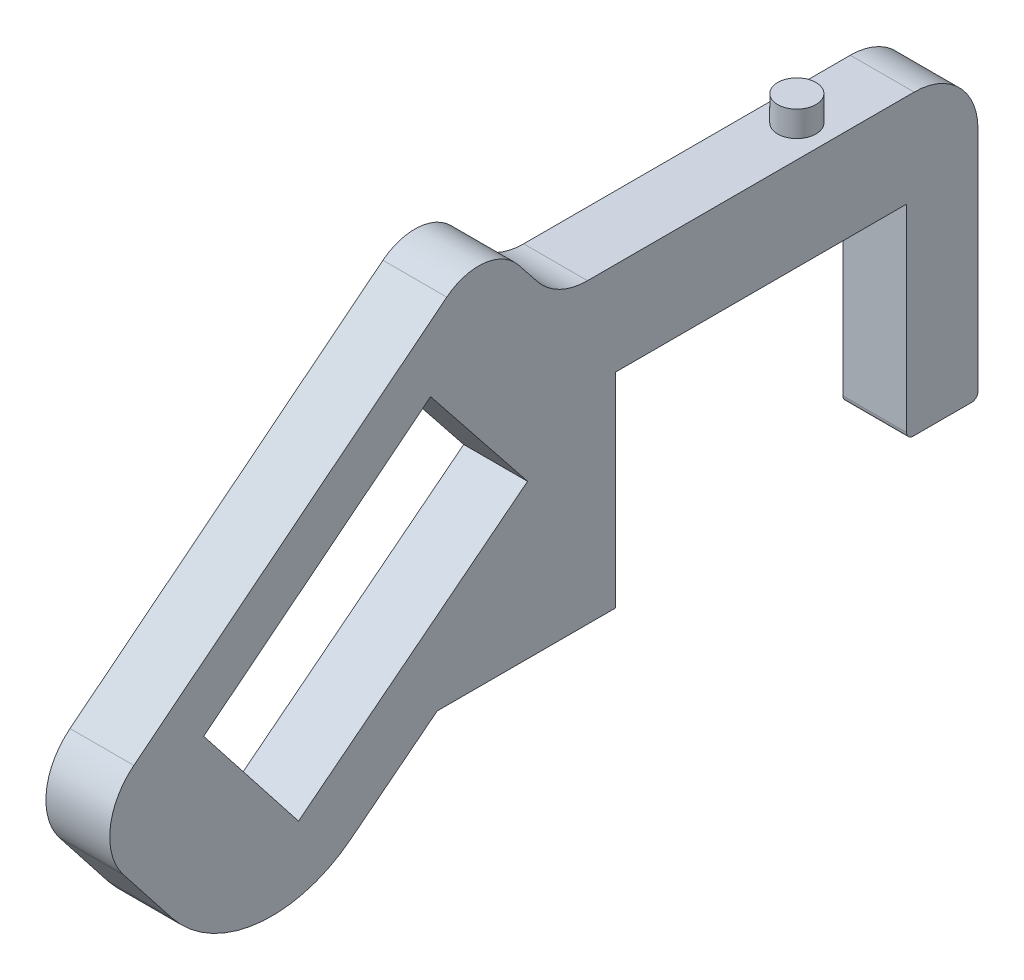
ISO-10303-21;
HEADER;
FILE_DESCRIPTION(('STEP AP214'),'2;1');
FILE_NAME('part.step','',(''),(''),'','','');
FILE_SCHEMA(('AUTOMOTIVE_DESIGN { 1 0 10303 214 1 1 1 1 }'));
ENDSEC;
DATA;
#1=APPLICATION_CONTEXT('core data for automotive mechanical design processes');
#2=APPLICATION_PROTOCOL_DEFINITION('international standard','automotive_design',2000,#1);
#3=PRODUCT_CONTEXT('',#1,'mechanical');
#4=PRODUCT('Part','Part','',(#3));
#5=PRODUCT_RELATED_PRODUCT_CATEGORY('part','',(#4));
#6=PRODUCT_DEFINITION_FORMATION('','',#4);
#7=PRODUCT_DEFINITION_CONTEXT('part definition',#1,'design');
#8=PRODUCT_DEFINITION('design','',#6,#7);
#9=PRODUCT_DEFINITION_SHAPE('','',#8);
#10=(LENGTH_UNIT() NAMED_UNIT(*) SI_UNIT(.MILLI.,.METRE.));
#11=(NAMED_UNIT(*) PLANE_ANGLE_UNIT() SI_UNIT($,.RADIAN.));
#12=(NAMED_UNIT(*) SI_UNIT($,.STERADIAN.) SOLID_ANGLE_UNIT());
#13=UNCERTAINTY_MEASURE_WITH_UNIT(LENGTH_MEASURE(1.E-05),#10,'distance_accuracy_value','');
#14=(GEOMETRIC_REPRESENTATION_CONTEXT(3) GLOBAL_UNCERTAINTY_ASSIGNED_CONTEXT((#13)) GLOBAL_UNIT_ASSIGNED_CONTEXT((#10,
#11,#12)) REPRESENTATION_CONTEXT('',''));
#15=CARTESIAN_POINT('',(0.,0.,0.));
#16=DIRECTION('',(0.,0.,1.));
#17=DIRECTION('',(1.,0.,0.));
#18=AXIS2_PLACEMENT_3D('',#15,#16,#17);
#19=CARTESIAN_POINT('',(5.,15.3,-11.9858517092675));
#20=DIRECTION('',(0.,-1.,0.));
#21=DIRECTION('',(0.,0.,-1.));
#22=AXIS2_PLACEMENT_3D('',#19,#20,#21);
#23=PLANE('',#22);
#24=DIRECTION('',(0.,0.,1.));
#25=VECTOR('',#24,1.);
#26=CARTESIAN_POINT('',(0.,15.3,-11.9858517092675));
#27=LINE('',#26,#25);
#28=CARTESIAN_POINT('',(0.,15.3,-11.9858517092675));
#29=VERTEX_POINT('',#28);
#30=CARTESIAN_POINT('',(0.,15.3,13.5965839190351));
#31=VERTEX_POINT('',#30);
#32=EDGE_CURVE('E274',#29,#31,#27,.T.);
#33=ORIENTED_EDGE('',*,*,#32,.T.);
#34=DIRECTION('',(-1.,0.,0.));
#35=VECTOR('',#34,1.);
#36=CARTESIAN_POINT('',(5.,15.3,13.5965839190351));
#37=LINE('',#36,#35);
#38=CARTESIAN_POINT('',(5.,15.3,13.5965839190351));
#39=VERTEX_POINT('',#38);
#40=EDGE_CURVE('E319',#39,#31,#37,.T.);
#41=ORIENTED_EDGE('',*,*,#40,.F.);
#42=DIRECTION('',(0.,0.,1.));
#43=VECTOR('',#42,1.);
#44=CARTESIAN_POINT('',(5.,15.3,-11.9858517092675));
#45=LINE('',#44,#43);
#46=CARTESIAN_POINT('',(5.,15.3,-11.9858517092675));
#47=VERTEX_POINT('',#46);
#48=EDGE_CURVE('E237',#47,#39,#45,.T.);
#49=ORIENTED_EDGE('',*,*,#48,.F.);
#50=DIRECTION('',(-1.,0.,0.));
#51=VECTOR('',#50,1.);
#52=CARTESIAN_POINT('',(5.,15.3,-11.9858517092675));
#53=LINE('',#52,#51);
#54=EDGE_CURVE('E322',#47,#29,#53,.T.);
#55=ORIENTED_EDGE('',*,*,#54,.T.);
#56=EDGE_LOOP('',(#33,#41,#49,#55));
#57=FACE_BOUND('',#56,.T.);
#58=CARTESIAN_POINT('',(2.5,15.3,-5.29585170926751));
#59=DIRECTION('',(0.,-1.,0.));
#60=DIRECTION('',(0.,0.,-1.));
#61=AXIS2_PLACEMENT_3D('',#58,#59,#60);
#62=CIRCLE('',#61,1.5);
#63=CARTESIAN_POINT('',(2.5,15.3,-6.79585170926751));
#64=VERTEX_POINT('',#63);
#65=EDGE_CURVE('E11',#64,#64,#62,.F.);
#66=ORIENTED_EDGE('',*,*,#65,.F.);
#67=EDGE_LOOP('',(#66));
#68=FACE_BOUND('',#67,.T.);
#69=ADVANCED_FACE('F31',(#57,#68),#23,.F.);
#70=CARTESIAN_POINT('',(5.,-5.43975606599762,38.3096722610078));
#71=DIRECTION('',(-1.,0.,0.));
#72=DIRECTION('',(0.,0.,1.));
#73=AXIS2_PLACEMENT_3D('',#70,#71,#72);
#74=PLANE('',#73);
#75=DIRECTION('',(0.,1.,0.));
#76=VECTOR('',#75,1.);
#77=CARTESIAN_POINT('',(5.,8.,11.4));
#78=LINE('',#77,#76);
#79=CARTESIAN_POINT('',(5.,-8.,11.4));
#80=VERTEX_POINT('',#79);
#81=CARTESIAN_POINT('',(5.,8.,11.4));
#82=VERTEX_POINT('',#81);
#83=EDGE_CURVE('E219',#80,#82,#78,.T.);
#84=ORIENTED_EDGE('',*,*,#83,.T.);
#85=DIRECTION('',(0.,0.,-1.));
#86=VECTOR('',#85,1.);
#87=CARTESIAN_POINT('',(5.,8.,11.4));
#88=LINE('',#87,#86);
#89=CARTESIAN_POINT('',(5.,8.,-11.4));
#90=VERTEX_POINT('',#89);
#91=EDGE_CURVE('E222',#82,#90,#88,.T.);
#92=ORIENTED_EDGE('',*,*,#91,.T.);
#93=DIRECTION('',(0.,-1.,0.));
#94=VECTOR('',#93,1.);
#95=CARTESIAN_POINT('',(5.,8.,-11.4));
#96=LINE('',#95,#94);
#97=CARTESIAN_POINT('',(5.,-7.5,-11.4));
#98=VERTEX_POINT('',#97);
#99=EDGE_CURVE('E225',#90,#98,#96,.T.);
#100=ORIENTED_EDGE('',*,*,#99,.T.);
#101=CARTESIAN_POINT('',(5.,-7.5,-11.9));
#102=DIRECTION('',(1.,0.,0.));
#103=DIRECTION('',(0.,0.,1.));
#104=AXIS2_PLACEMENT_3D('',#101,#102,#103);
#105=CIRCLE('',#104,0.500000000000001);
#106=CARTESIAN_POINT('',(5.,-8.,-11.9));
#107=VERTEX_POINT('',#106);
#108=EDGE_CURVE('E227',#98,#107,#105,.T.);
#109=ORIENTED_EDGE('',*,*,#108,.T.);
#110=DIRECTION('',(0.,0.,-1.));
#111=VECTOR('',#110,1.);
#112=CARTESIAN_POINT('',(5.,-8.,-11.9));
#113=LINE('',#112,#111);
#114=CARTESIAN_POINT('',(5.,-8.,-16.4858517092675));
#115=VERTEX_POINT('',#114);
#116=EDGE_CURVE('E229',#107,#115,#113,.T.);
#117=ORIENTED_EDGE('',*,*,#116,.T.);
#118=CARTESIAN_POINT('',(5.,-7.5,-16.4858517092675));
#119=DIRECTION('',(1.,0.,0.));
#120=DIRECTION('',(0.,0.,-1.));
#121=AXIS2_PLACEMENT_3D('',#118,#119,#120);
#122=CIRCLE('',#121,0.5);
#123=CARTESIAN_POINT('',(5.,-7.5,-16.9858517092675));
#124=VERTEX_POINT('',#123);
#125=EDGE_CURVE('E231',#115,#124,#122,.T.);
#126=ORIENTED_EDGE('',*,*,#125,.T.);
#127=DIRECTION('',(0.,1.,0.));
#128=VECTOR('',#127,1.);
#129=CARTESIAN_POINT('',(5.,-7.5,-16.9858517092675));
#130=LINE('',#129,#128);
#131=CARTESIAN_POINT('',(5.,10.3,-16.9858517092675));
#132=VERTEX_POINT('',#131);
#133=EDGE_CURVE('E233',#124,#132,#130,.T.);
#134=ORIENTED_EDGE('',*,*,#133,.T.);
#135=CARTESIAN_POINT('',(5.,10.3,-11.9858517092675));
#136=DIRECTION('',(1.,0.,0.));
#137=DIRECTION('',(0.,0.,-1.));
#138=AXIS2_PLACEMENT_3D('',#135,#136,#137);
#139=CIRCLE('',#138,5.);
#140=EDGE_CURVE('E235',#132,#47,#139,.T.);
#141=ORIENTED_EDGE('',*,*,#140,.T.);
#142=ORIENTED_EDGE('',*,*,#48,.T.);
#143=CARTESIAN_POINT('',(5.,20.3,13.5965839190351));
#144=DIRECTION('',(-1.,0.,0.));
#145=DIRECTION('',(0.,0.,-1.));
#146=AXIS2_PLACEMENT_3D('',#143,#144,#145);
#147=CIRCLE('',#146,5.00000000000001);
#148=CARTESIAN_POINT('',(5.,17.186353684396,17.5087708549222));
#149=VERTEX_POINT('',#148);
#150=EDGE_CURVE('E239',#39,#149,#147,.T.);
#151=ORIENTED_EDGE('',*,*,#150,.T.);
#152=DIRECTION('',(0.,0.782437387177425,0.622729263120792));
#153=VECTOR('',#152,1.);
#154=CARTESIAN_POINT('',(5.,19.0558817681678,18.9966980233703));
#155=LINE('',#154,#153);
#156=CARTESIAN_POINT('',(5.,19.0558817681678,18.9966980233703));
#157=VERTEX_POINT('',#156);
#158=EDGE_CURVE('E241',#149,#157,#155,.T.);
#159=ORIENTED_EDGE('',*,*,#158,.T.);
#160=CARTESIAN_POINT('',(5.,16.5649647156846,22.12644757208));
#161=DIRECTION('',(1.,0.,0.));
#162=DIRECTION('',(0.,0.,1.));
#163=AXIS2_PLACEMENT_3D('',#160,#161,#162);
#164=CIRCLE('',#163,4.);
#165=CARTESIAN_POINT('',(5.,19.6947142643943,24.6173646245632));
#166=VERTEX_POINT('',#165);
#167=EDGE_CURVE('E243',#157,#166,#164,.T.);
#168=ORIENTED_EDGE('',*,*,#167,.T.);
#169=DIRECTION('',(0.,-0.622729263120793,0.782437387177424));
#170=VECTOR('',#169,1.);
#171=CARTESIAN_POINT('',(5.,19.6947142643943,24.6173646245632));
#172=LINE('',#171,#170);
#173=CARTESIAN_POINT('',(5.,0.189057119503341,49.1255358563794));
#174=VERTEX_POINT('',#173);
#175=EDGE_CURVE('E245',#166,#174,#172,.T.);
#176=ORIENTED_EDGE('',*,*,#175,.T.);
#177=CARTESIAN_POINT('',(5.,-3.7231298163838,46.0118895407754));
#178=DIRECTION('',(1.,0.,0.));
#179=DIRECTION('',(0.,0.,1.));
#180=AXIS2_PLACEMENT_3D('',#177,#178,#179);
#181=CIRCLE('',#180,5.);
#182=CARTESIAN_POINT('',(5.,-6.80954956947025,49.9455917546902));
#183=VERTEX_POINT('',#182);
#184=EDGE_CURVE('E247',#174,#183,#181,.T.);
#185=ORIENTED_EDGE('',*,*,#184,.T.);
#186=DIRECTION('',(0.,-0.786740442782954,-0.617283950617284));
#187=VECTOR('',#186,1.);
#188=CARTESIAN_POINT('',(5.,-6.80954956947025,49.9455917546902));
#189=LINE('',#188,#187);
#190=CARTESIAN_POINT('',(5.,-11.6125955721704,46.1770766888373));
#191=VERTEX_POINT('',#190);
#192=EDGE_CURVE('E249',#183,#191,#189,.T.);
#193=ORIENTED_EDGE('',*,*,#192,.T.);
#194=CARTESIAN_POINT('',(5.,-5.43975606599762,38.3096722610078));
#195=DIRECTION('',(1.,0.,0.));
#196=DIRECTION('',(0.,0.,1.));
#197=AXIS2_PLACEMENT_3D('',#194,#195,#196);
#198=CIRCLE('',#197,10.);
#199=CARTESIAN_POINT('',(5.,-13.3071604938271,32.1368327548348));
#200=VERTEX_POINT('',#199);
#201=EDGE_CURVE('E251',#191,#200,#198,.T.);
#202=ORIENTED_EDGE('',*,*,#201,.T.);
#203=DIRECTION('',(0.,0.617283950617285,-0.786740442782954));
#204=VECTOR('',#203,1.);
#205=CARTESIAN_POINT('',(5.,-13.3071604938271,32.1368327548349));
#206=LINE('',#205,#204);
#207=CARTESIAN_POINT('',(5.,-7.99999999999999,25.3727531239642));
#208=VERTEX_POINT('',#207);
#209=EDGE_CURVE('E253',#200,#208,#206,.T.);
#210=ORIENTED_EDGE('',*,*,#209,.T.);
#211=DIRECTION('',(0.,0.,-1.));
#212=VECTOR('',#211,1.);
#213=CARTESIAN_POINT('',(5.,-7.99999999999999,25.3727531239642));
#214=LINE('',#213,#212);
#215=EDGE_CURVE('E255',#208,#80,#214,.T.);
#216=ORIENTED_EDGE('',*,*,#215,.T.);
#217=EDGE_LOOP('',(#84,#92,#100,#109,#117,#126,#134,#141,#142,#151,#159,#168,#176,#185,#193,
#202,#210,#216));
#218=FACE_BOUND('',#217,.T.);
#219=DIRECTION('',(0.,0.617283950617284,-0.786740442782954));
#220=VECTOR('',#219,1.);
#221=CARTESIAN_POINT('',(5.,-10.037037037037,36.2278830573063));
#222=LINE('',#221,#220);
#223=CARTESIAN_POINT('',(5.,-10.037037037037,36.2278830573063));
#224=VERTEX_POINT('',#223);
#225=CARTESIAN_POINT('',(5.,4.03703703703704,18.2902009618549));
#226=VERTEX_POINT('',#225);
#227=EDGE_CURVE('E178',#224,#226,#222,.T.);
#228=ORIENTED_EDGE('',*,*,#227,.F.);
#229=DIRECTION('',(0.,-0.786740442782953,-0.617283950617285));
#230=VECTOR('',#229,1.);
#231=CARTESIAN_POINT('',(5.,-0.569942232820128,43.6558546777097));
#232=LINE('',#231,#230);
#233=CARTESIAN_POINT('',(5.,-0.569942232820129,43.6558546777097));
#234=VERTEX_POINT('',#233);
#235=EDGE_CURVE('E202',#234,#224,#232,.T.);
#236=ORIENTED_EDGE('',*,*,#235,.F.);
#237=DIRECTION('',(0.,-0.622729263120793,0.782437387177424));
#238=VECTOR('',#237,1.);
#239=CARTESIAN_POINT('',(5.,13.5759362417756,25.8820565787995));
#240=LINE('',#239,#238);
#241=CARTESIAN_POINT('',(5.,13.5759362417756,25.8820565787995));
#242=VERTEX_POINT('',#241);
#243=EDGE_CURVE('E200',#242,#234,#240,.T.);
#244=ORIENTED_EDGE('',*,*,#243,.F.);
#245=DIRECTION('',(0.,0.782437387177424,0.622729263120793));
#246=VECTOR('',#245,1.);
#247=CARTESIAN_POINT('',(5.,4.03703703703704,18.2902009618549));
#248=LINE('',#247,#246);
#249=EDGE_CURVE('E186',#226,#242,#248,.T.);
#250=ORIENTED_EDGE('',*,*,#249,.F.);
#251=EDGE_LOOP('',(#228,#236,#244,#250));
#252=FACE_BOUND('',#251,.T.);
#253=ADVANCED_FACE('F199',(#218,#252),#74,.F.);
#254=CARTESIAN_POINT('',(0.,-5.43975606599762,38.3096722610078));
#255=DIRECTION('',(-1.,0.,0.));
#256=DIRECTION('',(0.,0.,1.));
#257=AXIS2_PLACEMENT_3D('',#254,#255,#256);
#258=PLANE('',#257);
#259=DIRECTION('',(0.,1.,0.));
#260=VECTOR('',#259,1.);
#261=CARTESIAN_POINT('',(0.,8.,11.4));
#262=LINE('',#261,#260);
#263=CARTESIAN_POINT('',(0.,-8.,11.4));
#264=VERTEX_POINT('',#263);
#265=CARTESIAN_POINT('',(0.,8.,11.4));
#266=VERTEX_POINT('',#265);
#267=EDGE_CURVE('E195',#264,#266,#262,.T.);
#268=ORIENTED_EDGE('',*,*,#267,.F.);
#269=DIRECTION('',(0.,0.,-1.));
#270=VECTOR('',#269,1.);
#271=CARTESIAN_POINT('',(0.,-7.99999999999999,25.3727531239642));
#272=LINE('',#271,#270);
#273=CARTESIAN_POINT('',(0.,-7.99999999999999,25.3727531239642));
#274=VERTEX_POINT('',#273);
#275=EDGE_CURVE('E223',#274,#264,#272,.T.);
#276=ORIENTED_EDGE('',*,*,#275,.F.);
#277=DIRECTION('',(0.,0.617283950617285,-0.786740442782954));
#278=VECTOR('',#277,1.);
#279=CARTESIAN_POINT('',(0.,-13.3071604938271,32.1368327548349));
#280=LINE('',#279,#278);
#281=CARTESIAN_POINT('',(0.,-13.3071604938271,32.1368327548348));
#282=VERTEX_POINT('',#281);
#283=EDGE_CURVE('E290',#282,#274,#280,.T.);
#284=ORIENTED_EDGE('',*,*,#283,.F.);
#285=CARTESIAN_POINT('',(0.,-5.43975606599762,38.3096722610078));
#286=DIRECTION('',(1.,0.,0.));
#287=DIRECTION('',(0.,0.,1.));
#288=AXIS2_PLACEMENT_3D('',#285,#286,#287);
#289=CIRCLE('',#288,10.);
#290=CARTESIAN_POINT('',(0.,-11.6125955721704,46.1770766888373));
#291=VERTEX_POINT('',#290);
#292=EDGE_CURVE('E288',#291,#282,#289,.T.);
#293=ORIENTED_EDGE('',*,*,#292,.F.);
#294=DIRECTION('',(0.,-0.786740442782954,-0.617283950617284));
#295=VECTOR('',#294,1.);
#296=CARTESIAN_POINT('',(0.,-6.80954956947025,49.9455917546902));
#297=LINE('',#296,#295);
#298=CARTESIAN_POINT('',(0.,-6.80954956947025,49.9455917546902));
#299=VERTEX_POINT('',#298);
#300=EDGE_CURVE('E286',#299,#291,#297,.T.);
#301=ORIENTED_EDGE('',*,*,#300,.F.);
#302=CARTESIAN_POINT('',(0.,-3.7231298163838,46.0118895407754));
#303=DIRECTION('',(1.,0.,0.));
#304=DIRECTION('',(0.,0.,1.));
#305=AXIS2_PLACEMENT_3D('',#302,#303,#304);
#306=CIRCLE('',#305,5.);
#307=CARTESIAN_POINT('',(0.,0.189057119503341,49.1255358563794));
#308=VERTEX_POINT('',#307);
#309=EDGE_CURVE('E284',#308,#299,#306,.T.);
#310=ORIENTED_EDGE('',*,*,#309,.F.);
#311=DIRECTION('',(0.,-0.622729263120793,0.782437387177424));
#312=VECTOR('',#311,1.);
#313=CARTESIAN_POINT('',(0.,19.6947142643943,24.6173646245632));
#314=LINE('',#313,#312);
#315=CARTESIAN_POINT('',(0.,19.6947142643943,24.6173646245632));
#316=VERTEX_POINT('',#315);
#317=EDGE_CURVE('E282',#316,#308,#314,.T.);
#318=ORIENTED_EDGE('',*,*,#317,.F.);
#319=CARTESIAN_POINT('',(0.,16.5649647156846,22.12644757208));
#320=DIRECTION('',(1.,0.,0.));
#321=DIRECTION('',(0.,0.,1.));
#322=AXIS2_PLACEMENT_3D('',#319,#320,#321);
#323=CIRCLE('',#322,4.);
#324=CARTESIAN_POINT('',(0.,19.0558817681678,18.9966980233703));
#325=VERTEX_POINT('',#324);
#326=EDGE_CURVE('E280',#325,#316,#323,.T.);
#327=ORIENTED_EDGE('',*,*,#326,.F.);
#328=DIRECTION('',(0.,0.782437387177425,0.622729263120792));
#329=VECTOR('',#328,1.);
#330=CARTESIAN_POINT('',(0.,19.0558817681678,18.9966980233703));
#331=LINE('',#330,#329);
#332=CARTESIAN_POINT('',(0.,17.186353684396,17.5087708549222));
#333=VERTEX_POINT('',#332);
#334=EDGE_CURVE('E278',#333,#325,#331,.T.);
#335=ORIENTED_EDGE('',*,*,#334,.F.);
#336=CARTESIAN_POINT('',(0.,20.3,13.5965839190351));
#337=DIRECTION('',(-1.,0.,0.));
#338=DIRECTION('',(0.,0.,-1.));
#339=AXIS2_PLACEMENT_3D('',#336,#337,#338);
#340=CIRCLE('',#339,5.00000000000001);
#341=EDGE_CURVE('E276',#31,#333,#340,.T.);
#342=ORIENTED_EDGE('',*,*,#341,.F.);
#343=ORIENTED_EDGE('',*,*,#32,.F.);
#344=CARTESIAN_POINT('',(0.,10.3,-11.9858517092675));
#345=DIRECTION('',(1.,0.,0.));
#346=DIRECTION('',(0.,0.,-1.));
#347=AXIS2_PLACEMENT_3D('',#344,#345,#346);
#348=CIRCLE('',#347,5.);
#349=CARTESIAN_POINT('',(0.,10.3,-16.9858517092675));
#350=VERTEX_POINT('',#349);
#351=EDGE_CURVE('E272',#350,#29,#348,.T.);
#352=ORIENTED_EDGE('',*,*,#351,.F.);
#353=DIRECTION('',(0.,1.,0.));
#354=VECTOR('',#353,1.);
#355=CARTESIAN_POINT('',(0.,-7.5,-16.9858517092675));
#356=LINE('',#355,#354);
#357=CARTESIAN_POINT('',(0.,-7.5,-16.9858517092675));
#358=VERTEX_POINT('',#357);
#359=EDGE_CURVE('E270',#358,#350,#356,.T.);
#360=ORIENTED_EDGE('',*,*,#359,.F.);
#361=CARTESIAN_POINT('',(0.,-7.5,-16.4858517092675));
#362=DIRECTION('',(1.,0.,0.));
#363=DIRECTION('',(0.,0.,-1.));
#364=AXIS2_PLACEMENT_3D('',#361,#362,#363);
#365=CIRCLE('',#364,0.5);
#366=CARTESIAN_POINT('',(0.,-8.,-16.4858517092675));
#367=VERTEX_POINT('',#366);
#368=EDGE_CURVE('E268',#367,#358,#365,.T.);
#369=ORIENTED_EDGE('',*,*,#368,.F.);
#370=DIRECTION('',(0.,0.,-1.));
#371=VECTOR('',#370,1.);
#372=CARTESIAN_POINT('',(0.,-8.,-11.9));
#373=LINE('',#372,#371);
#374=CARTESIAN_POINT('',(0.,-8.,-11.9));
#375=VERTEX_POINT('',#374);
#376=EDGE_CURVE('E266',#375,#367,#373,.T.);
#377=ORIENTED_EDGE('',*,*,#376,.F.);
#378=CARTESIAN_POINT('',(0.,-7.5,-11.9));
#379=DIRECTION('',(1.,0.,0.));
#380=DIRECTION('',(0.,0.,1.));
#381=AXIS2_PLACEMENT_3D('',#378,#379,#380);
#382=CIRCLE('',#381,0.500000000000001);
#383=CARTESIAN_POINT('',(0.,-7.5,-11.4));
#384=VERTEX_POINT('',#383);
#385=EDGE_CURVE('E264',#384,#375,#382,.T.);
#386=ORIENTED_EDGE('',*,*,#385,.F.);
#387=DIRECTION('',(0.,-1.,0.));
#388=VECTOR('',#387,1.);
#389=CARTESIAN_POINT('',(0.,8.,-11.4));
#390=LINE('',#389,#388);
#391=CARTESIAN_POINT('',(0.,8.,-11.4));
#392=VERTEX_POINT('',#391);
#393=EDGE_CURVE('E262',#392,#384,#390,.T.);
#394=ORIENTED_EDGE('',*,*,#393,.F.);
#395=DIRECTION('',(0.,0.,-1.));
#396=VECTOR('',#395,1.);
#397=CARTESIAN_POINT('',(0.,8.,11.4));
#398=LINE('',#397,#396);
#399=EDGE_CURVE('E260',#266,#392,#398,.T.);
#400=ORIENTED_EDGE('',*,*,#399,.F.);
#401=EDGE_LOOP('',(#268,#276,#284,#293,#301,#310,#318,#327,#335,#342,#343,#352,#360,#369,#377,
#386,#394,#400));
#402=FACE_BOUND('',#401,.T.);
#403=DIRECTION('',(0.,-0.786740442782953,-0.617283950617285));
#404=VECTOR('',#403,1.);
#405=CARTESIAN_POINT('',(0.,-0.569942232820128,43.6558546777097));
#406=LINE('',#405,#404);
#407=CARTESIAN_POINT('',(0.,-0.569942232820128,43.6558546777097));
#408=VERTEX_POINT('',#407);
#409=CARTESIAN_POINT('',(0.,-10.037037037037,36.2278830573063));
#410=VERTEX_POINT('',#409);
#411=EDGE_CURVE('E187',#408,#410,#406,.T.);
#412=ORIENTED_EDGE('',*,*,#411,.T.);
#413=DIRECTION('',(0.,0.617283950617284,-0.786740442782954));
#414=VECTOR('',#413,1.);
#415=CARTESIAN_POINT('',(0.,-3.,27.2590420095806));
#416=LINE('',#415,#414);
#417=CARTESIAN_POINT('',(0.,4.03703703703704,18.2902009618549));
#418=VERTEX_POINT('',#417);
#419=EDGE_CURVE('E207',#410,#418,#416,.T.);
#420=ORIENTED_EDGE('',*,*,#419,.T.);
#421=DIRECTION('',(0.,0.782437387177424,0.622729263120793));
#422=VECTOR('',#421,1.);
#423=CARTESIAN_POINT('',(0.,4.03703703703704,18.2902009618549));
#424=LINE('',#423,#422);
#425=CARTESIAN_POINT('',(0.,13.5759362417756,25.8820565787995));
#426=VERTEX_POINT('',#425);
#427=EDGE_CURVE('E193',#418,#426,#424,.T.);
#428=ORIENTED_EDGE('',*,*,#427,.T.);
#429=DIRECTION('',(0.,-0.622729263120793,0.782437387177424));
#430=VECTOR('',#429,1.);
#431=CARTESIAN_POINT('',(0.,13.5759362417756,25.8820565787995));
#432=LINE('',#431,#430);
#433=EDGE_CURVE('E211',#426,#408,#432,.T.);
#434=ORIENTED_EDGE('',*,*,#433,.T.);
#435=EDGE_LOOP('',(#412,#420,#428,#434));
#436=FACE_BOUND('',#435,.T.);
#437=ADVANCED_FACE('F353',(#402,#436),#258,.T.);
#438=CARTESIAN_POINT('',(5.,8.,11.4));
#439=DIRECTION('',(0.,0.,1.));
#440=DIRECTION('',(0.,-1.,0.));
#441=AXIS2_PLACEMENT_3D('',#438,#439,#440);
#442=PLANE('',#441);
#443=ORIENTED_EDGE('',*,*,#267,.T.);
#444=DIRECTION('',(-1.,0.,0.));
#445=VECTOR('',#444,1.);
#446=CARTESIAN_POINT('',(5.,8.,11.4));
#447=LINE('',#446,#445);
#448=EDGE_CURVE('E39',#82,#266,#447,.T.);
#449=ORIENTED_EDGE('',*,*,#448,.F.);
#450=ORIENTED_EDGE('',*,*,#83,.F.);
#451=DIRECTION('',(-1.,0.,0.));
#452=VECTOR('',#451,1.);
#453=CARTESIAN_POINT('',(5.,-8.,11.4));
#454=LINE('',#453,#452);
#455=EDGE_CURVE('E257',#80,#264,#454,.T.);
#456=ORIENTED_EDGE('',*,*,#455,.T.);
#457=EDGE_LOOP('',(#443,#449,#450,#456));
#458=FACE_BOUND('',#457,.T.);
#459=ADVANCED_FACE('F33',(#458),#442,.F.);
#460=CARTESIAN_POINT('',(5.,8.,11.4));
#461=DIRECTION('',(0.,1.,0.));
#462=DIRECTION('',(0.,0.,1.));
#463=AXIS2_PLACEMENT_3D('',#460,#461,#462);
#464=PLANE('',#463);
#465=ORIENTED_EDGE('',*,*,#399,.T.);
#466=DIRECTION('',(-1.,0.,0.));
#467=VECTOR('',#466,1.);
#468=CARTESIAN_POINT('',(5.,8.,-11.4));
#469=LINE('',#468,#467);
#470=EDGE_CURVE('E340',#90,#392,#469,.T.);
#471=ORIENTED_EDGE('',*,*,#470,.F.);
#472=ORIENTED_EDGE('',*,*,#91,.F.);
#473=ORIENTED_EDGE('',*,*,#448,.T.);
#474=EDGE_LOOP('',(#465,#471,#472,#473));
#475=FACE_BOUND('',#474,.T.);
#476=ADVANCED_FACE('F345',(#475),#464,.F.);
#477=CARTESIAN_POINT('',(5.,8.,-11.4));
#478=DIRECTION('',(0.,0.,-1.));
#479=DIRECTION('',(0.,1.,0.));
#480=AXIS2_PLACEMENT_3D('',#477,#478,#479);
#481=PLANE('',#480);
#482=ORIENTED_EDGE('',*,*,#393,.T.);
#483=DIRECTION('',(-1.,0.,0.));
#484=VECTOR('',#483,1.);
#485=CARTESIAN_POINT('',(5.,-7.5,-11.4));
#486=LINE('',#485,#484);
#487=EDGE_CURVE('E337',#98,#384,#486,.T.);
#488=ORIENTED_EDGE('',*,*,#487,.F.);
#489=ORIENTED_EDGE('',*,*,#99,.F.);
#490=ORIENTED_EDGE('',*,*,#470,.T.);
#491=EDGE_LOOP('',(#482,#488,#489,#490));
#492=FACE_BOUND('',#491,.T.);
#493=ADVANCED_FACE('F361',(#492),#481,.F.);
#494=CARTESIAN_POINT('',(5.,-7.5,-11.9));
#495=DIRECTION('',(-1.,0.,0.));
#496=DIRECTION('',(0.,0.,1.));
#497=AXIS2_PLACEMENT_3D('',#494,#495,#496);
#498=CYLINDRICAL_SURFACE('',#497,0.500000000000001);
#499=ORIENTED_EDGE('',*,*,#385,.T.);
#500=DIRECTION('',(-1.,0.,0.));
#501=VECTOR('',#500,1.);
#502=CARTESIAN_POINT('',(5.,-8.,-11.9));
#503=LINE('',#502,#501);
#504=EDGE_CURVE('E334',#107,#375,#503,.T.);
#505=ORIENTED_EDGE('',*,*,#504,.F.);
#506=ORIENTED_EDGE('',*,*,#108,.F.);
#507=ORIENTED_EDGE('',*,*,#487,.T.);
#508=EDGE_LOOP('',(#499,#505,#506,#507));
#509=FACE_BOUND('',#508,.T.);
#510=ADVANCED_FACE('F365',(#509),#498,.T.);
#511=CARTESIAN_POINT('',(5.,-8.,-11.9));
#512=DIRECTION('',(0.,1.,0.));
#513=DIRECTION('',(0.,0.,1.));
#514=AXIS2_PLACEMENT_3D('',#511,#512,#513);
#515=PLANE('',#514);
#516=ORIENTED_EDGE('',*,*,#376,.T.);
#517=DIRECTION('',(-1.,0.,0.));
#518=VECTOR('',#517,1.);
#519=CARTESIAN_POINT('',(5.,-8.,-16.4858517092675));
#520=LINE('',#519,#518);
#521=EDGE_CURVE('E331',#115,#367,#520,.T.);
#522=ORIENTED_EDGE('',*,*,#521,.F.);
#523=ORIENTED_EDGE('',*,*,#116,.F.);
#524=ORIENTED_EDGE('',*,*,#504,.T.);
#525=EDGE_LOOP('',(#516,#522,#523,#524));
#526=FACE_BOUND('',#525,.T.);
#527=ADVANCED_FACE('F433',(#526),#515,.F.);
#528=CARTESIAN_POINT('',(5.,-7.5,-16.4858517092675));
#529=DIRECTION('',(-1.,0.,0.));
#530=DIRECTION('',(0.,0.,1.));
#531=AXIS2_PLACEMENT_3D('',#528,#529,#530);
#532=CYLINDRICAL_SURFACE('',#531,0.5);
#533=ORIENTED_EDGE('',*,*,#368,.T.);
#534=DIRECTION('',(-1.,0.,0.));
#535=VECTOR('',#534,1.);
#536=CARTESIAN_POINT('',(5.,-7.5,-16.9858517092675));
#537=LINE('',#536,#535);
#538=EDGE_CURVE('E328',#124,#358,#537,.T.);
#539=ORIENTED_EDGE('',*,*,#538,.F.);
#540=ORIENTED_EDGE('',*,*,#125,.F.);
#541=ORIENTED_EDGE('',*,*,#521,.T.);
#542=EDGE_LOOP('',(#533,#539,#540,#541));
#543=FACE_BOUND('',#542,.T.);
#544=ADVANCED_FACE('F431',(#543),#532,.T.);
#545=CARTESIAN_POINT('',(5.,-7.5,-16.9858517092675));
#546=DIRECTION('',(0.,0.,1.));
#547=DIRECTION('',(0.,-1.,0.));
#548=AXIS2_PLACEMENT_3D('',#545,#546,#547);
#549=PLANE('',#548);
#550=ORIENTED_EDGE('',*,*,#359,.T.);
#551=DIRECTION('',(-1.,0.,0.));
#552=VECTOR('',#551,1.);
#553=CARTESIAN_POINT('',(5.,10.3,-16.9858517092675));
#554=LINE('',#553,#552);
#555=EDGE_CURVE('E325',#132,#350,#554,.T.);
#556=ORIENTED_EDGE('',*,*,#555,.F.);
#557=ORIENTED_EDGE('',*,*,#133,.F.);
#558=ORIENTED_EDGE('',*,*,#538,.T.);
#559=EDGE_LOOP('',(#550,#556,#557,#558));
#560=FACE_BOUND('',#559,.T.);
#561=ADVANCED_FACE('F426',(#560),#549,.F.);
#562=CARTESIAN_POINT('',(5.,10.3,-11.9858517092675));
#563=DIRECTION('',(-1.,0.,0.));
#564=DIRECTION('',(0.,0.,1.));
#565=AXIS2_PLACEMENT_3D('',#562,#563,#564);
#566=CYLINDRICAL_SURFACE('',#565,5.);
#567=ORIENTED_EDGE('',*,*,#351,.T.);
#568=ORIENTED_EDGE('',*,*,#54,.F.);
#569=ORIENTED_EDGE('',*,*,#140,.F.);
#570=ORIENTED_EDGE('',*,*,#555,.T.);
#571=EDGE_LOOP('',(#567,#568,#569,#570));
#572=FACE_BOUND('',#571,.T.);
#573=ADVANCED_FACE('F421',(#572),#566,.T.);
#574=CARTESIAN_POINT('',(5.,20.3,13.5965839190351));
#575=DIRECTION('',(-1.,0.,0.));
#576=DIRECTION('',(0.,0.,1.));
#577=AXIS2_PLACEMENT_3D('',#574,#575,#576);
#578=CYLINDRICAL_SURFACE('',#577,5.00000000000001);
#579=ORIENTED_EDGE('',*,*,#341,.T.);
#580=DIRECTION('',(-1.,0.,0.));
#581=VECTOR('',#580,1.);
#582=CARTESIAN_POINT('',(5.,17.186353684396,17.5087708549222));
#583=LINE('',#582,#581);
#584=EDGE_CURVE('E316',#149,#333,#583,.T.);
#585=ORIENTED_EDGE('',*,*,#584,.F.);
#586=ORIENTED_EDGE('',*,*,#150,.F.);
#587=ORIENTED_EDGE('',*,*,#40,.T.);
#588=EDGE_LOOP('',(#579,#585,#586,#587));
#589=FACE_BOUND('',#588,.T.);
#590=ADVANCED_FACE('F412',(#589),#578,.F.);
#591=CARTESIAN_POINT('',(5.,19.0558817681678,18.9966980233703));
#592=DIRECTION('',(0.,-0.622729263120792,0.782437387177425));
#593=DIRECTION('',(0.,-0.782437387177425,-0.622729263120792));
#594=AXIS2_PLACEMENT_3D('',#591,#592,#593);
#595=PLANE('',#594);
#596=ORIENTED_EDGE('',*,*,#334,.T.);
#597=DIRECTION('',(-1.,0.,0.));
#598=VECTOR('',#597,1.);
#599=CARTESIAN_POINT('',(5.,19.0558817681678,18.9966980233703));
#600=LINE('',#599,#598);
#601=EDGE_CURVE('E313',#157,#325,#600,.T.);
#602=ORIENTED_EDGE('',*,*,#601,.F.);
#603=ORIENTED_EDGE('',*,*,#158,.F.);
#604=ORIENTED_EDGE('',*,*,#584,.T.);
#605=EDGE_LOOP('',(#596,#602,#603,#604));
#606=FACE_BOUND('',#605,.T.);
#607=ADVANCED_FACE('F406',(#606),#595,.F.);
#608=CARTESIAN_POINT('',(5.,16.5649647156846,22.12644757208));
#609=DIRECTION('',(-1.,0.,0.));
#610=DIRECTION('',(0.,0.,1.));
#611=AXIS2_PLACEMENT_3D('',#608,#609,#610);
#612=CYLINDRICAL_SURFACE('',#611,4.);
#613=ORIENTED_EDGE('',*,*,#326,.T.);
#614=DIRECTION('',(-1.,0.,0.));
#615=VECTOR('',#614,1.);
#616=CARTESIAN_POINT('',(5.,19.6947142643943,24.6173646245632));
#617=LINE('',#616,#615);
#618=EDGE_CURVE('E310',#166,#316,#617,.T.);
#619=ORIENTED_EDGE('',*,*,#618,.F.);
#620=ORIENTED_EDGE('',*,*,#167,.F.);
#621=ORIENTED_EDGE('',*,*,#601,.T.);
#622=EDGE_LOOP('',(#613,#619,#620,#621));
#623=FACE_BOUND('',#622,.T.);
#624=ADVANCED_FACE('F402',(#623),#612,.T.);
#625=CARTESIAN_POINT('',(5.,19.6947142643943,24.6173646245632));
#626=DIRECTION('',(0.,-0.782437387177424,-0.622729263120793));
#627=DIRECTION('',(0.,0.622729263120793,-0.782437387177424));
#628=AXIS2_PLACEMENT_3D('',#625,#626,#627);
#629=PLANE('',#628);
#630=ORIENTED_EDGE('',*,*,#317,.T.);
#631=DIRECTION('',(-1.,0.,0.));
#632=VECTOR('',#631,1.);
#633=CARTESIAN_POINT('',(5.,0.189057119503341,49.1255358563794));
#634=LINE('',#633,#632);
#635=EDGE_CURVE('E307',#174,#308,#634,.T.);
#636=ORIENTED_EDGE('',*,*,#635,.F.);
#637=ORIENTED_EDGE('',*,*,#175,.F.);
#638=ORIENTED_EDGE('',*,*,#618,.T.);
#639=EDGE_LOOP('',(#630,#636,#637,#638));
#640=FACE_BOUND('',#639,.T.);
#641=ADVANCED_FACE('F397',(#640),#629,.F.);
#642=CARTESIAN_POINT('',(5.,-3.7231298163838,46.0118895407754));
#643=DIRECTION('',(-1.,0.,0.));
#644=DIRECTION('',(0.,0.,1.));
#645=AXIS2_PLACEMENT_3D('',#642,#643,#644);
#646=CYLINDRICAL_SURFACE('',#645,5.);
#647=ORIENTED_EDGE('',*,*,#309,.T.);
#648=DIRECTION('',(-1.,0.,0.));
#649=VECTOR('',#648,1.);
#650=CARTESIAN_POINT('',(5.,-6.80954956947025,49.9455917546902));
#651=LINE('',#650,#649);
#652=EDGE_CURVE('E304',#183,#299,#651,.T.);
#653=ORIENTED_EDGE('',*,*,#652,.F.);
#654=ORIENTED_EDGE('',*,*,#184,.F.);
#655=ORIENTED_EDGE('',*,*,#635,.T.);
#656=EDGE_LOOP('',(#647,#653,#654,#655));
#657=FACE_BOUND('',#656,.T.);
#658=ADVANCED_FACE('F391',(#657),#646,.T.);
#659=CARTESIAN_POINT('',(5.,-6.80954956947025,49.9455917546902));
#660=DIRECTION('',(0.,0.617283950617284,-0.786740442782954));
#661=DIRECTION('',(0.,0.786740442782954,0.617283950617284));
#662=AXIS2_PLACEMENT_3D('',#659,#660,#661);
#663=PLANE('',#662);
#664=ORIENTED_EDGE('',*,*,#300,.T.);
#665=DIRECTION('',(-1.,0.,0.));
#666=VECTOR('',#665,1.);
#667=CARTESIAN_POINT('',(5.,-11.6125955721704,46.1770766888373));
#668=LINE('',#667,#666);
#669=EDGE_CURVE('E301',#191,#291,#668,.T.);
#670=ORIENTED_EDGE('',*,*,#669,.F.);
#671=ORIENTED_EDGE('',*,*,#192,.F.);
#672=ORIENTED_EDGE('',*,*,#652,.T.);
#673=EDGE_LOOP('',(#664,#670,#671,#672));
#674=FACE_BOUND('',#673,.T.);
#675=ADVANCED_FACE('F387',(#674),#663,.F.);
#676=CARTESIAN_POINT('',(5.,-5.43975606599762,38.3096722610078));
#677=DIRECTION('',(-1.,0.,0.));
#678=DIRECTION('',(0.,0.,1.));
#679=AXIS2_PLACEMENT_3D('',#676,#677,#678);
#680=CYLINDRICAL_SURFACE('',#679,10.);
#681=ORIENTED_EDGE('',*,*,#292,.T.);
#682=DIRECTION('',(-1.,0.,0.));
#683=VECTOR('',#682,1.);
#684=CARTESIAN_POINT('',(5.,-13.3071604938271,32.1368327548348));
#685=LINE('',#684,#683);
#686=EDGE_CURVE('E298',#200,#282,#685,.T.);
#687=ORIENTED_EDGE('',*,*,#686,.F.);
#688=ORIENTED_EDGE('',*,*,#201,.F.);
#689=ORIENTED_EDGE('',*,*,#669,.T.);
#690=EDGE_LOOP('',(#681,#687,#688,#689));
#691=FACE_BOUND('',#690,.T.);
#692=ADVANCED_FACE('F382',(#691),#680,.T.);
#693=CARTESIAN_POINT('',(5.,-13.3071604938271,32.1368327548349));
#694=DIRECTION('',(0.,0.786740442782954,0.617283950617285));
#695=DIRECTION('',(0.,-0.617283950617285,0.786740442782954));
#696=AXIS2_PLACEMENT_3D('',#693,#694,#695);
#697=PLANE('',#696);
#698=ORIENTED_EDGE('',*,*,#283,.T.);
#699=DIRECTION('',(-1.,0.,0.));
#700=VECTOR('',#699,1.);
#701=CARTESIAN_POINT('',(5.,-7.99999999999999,25.3727531239642));
#702=LINE('',#701,#700);
#703=EDGE_CURVE('E295',#208,#274,#702,.T.);
#704=ORIENTED_EDGE('',*,*,#703,.F.);
#705=ORIENTED_EDGE('',*,*,#209,.F.);
#706=ORIENTED_EDGE('',*,*,#686,.T.);
#707=EDGE_LOOP('',(#698,#704,#705,#706));
#708=FACE_BOUND('',#707,.T.);
#709=ADVANCED_FACE('F376',(#708),#697,.F.);
#710=CARTESIAN_POINT('',(5.,-7.99999999999999,25.3727531239642));
#711=DIRECTION('',(0.,1.,0.));
#712=DIRECTION('',(0.,0.,1.));
#713=AXIS2_PLACEMENT_3D('',#710,#711,#712);
#714=PLANE('',#713);
#715=ORIENTED_EDGE('',*,*,#275,.T.);
#716=ORIENTED_EDGE('',*,*,#455,.F.);
#717=ORIENTED_EDGE('',*,*,#215,.F.);
#718=ORIENTED_EDGE('',*,*,#703,.T.);
#719=EDGE_LOOP('',(#715,#716,#717,#718));
#720=FACE_BOUND('',#719,.T.);
#721=ADVANCED_FACE('F374',(#720),#714,.F.);
#722=CARTESIAN_POINT('',(5.,-3.,27.2590420095806));
#723=DIRECTION('',(0.,0.786740442782954,0.617283950617284));
#724=DIRECTION('',(0.,-0.617283950617284,0.786740442782954));
#725=AXIS2_PLACEMENT_3D('',#722,#723,#724);
#726=PLANE('',#725);
#727=ORIENTED_EDGE('',*,*,#419,.F.);
#728=DIRECTION('',(-1.,0.,0.));
#729=VECTOR('',#728,1.);
#730=CARTESIAN_POINT('',(5.,-10.037037037037,36.2278830573063));
#731=LINE('',#730,#729);
#732=EDGE_CURVE('E51',#224,#410,#731,.T.);
#733=ORIENTED_EDGE('',*,*,#732,.F.);
#734=ORIENTED_EDGE('',*,*,#227,.T.);
#735=DIRECTION('',(-1.,0.,0.));
#736=VECTOR('',#735,1.);
#737=CARTESIAN_POINT('',(5.,4.03703703703704,18.2902009618549));
#738=LINE('',#737,#736);
#739=EDGE_CURVE('E181',#226,#418,#738,.T.);
#740=ORIENTED_EDGE('',*,*,#739,.T.);
#741=EDGE_LOOP('',(#727,#733,#734,#740));
#742=FACE_BOUND('',#741,.T.);
#743=ADVANCED_FACE('F180',(#742),#726,.T.);
#744=CARTESIAN_POINT('',(5.,4.03703703703704,18.2902009618549));
#745=DIRECTION('',(0.,-0.622729263120793,0.782437387177424));
#746=DIRECTION('',(0.,-0.782437387177424,-0.622729263120793));
#747=AXIS2_PLACEMENT_3D('',#744,#745,#746);
#748=PLANE('',#747);
#749=ORIENTED_EDGE('',*,*,#427,.F.);
#750=ORIENTED_EDGE('',*,*,#739,.F.);
#751=ORIENTED_EDGE('',*,*,#249,.T.);
#752=DIRECTION('',(-1.,0.,0.));
#753=VECTOR('',#752,1.);
#754=CARTESIAN_POINT('',(5.,13.5759362417756,25.8820565787995));
#755=LINE('',#754,#753);
#756=EDGE_CURVE('E196',#242,#426,#755,.T.);
#757=ORIENTED_EDGE('',*,*,#756,.T.);
#758=EDGE_LOOP('',(#749,#750,#751,#757));
#759=FACE_BOUND('',#758,.T.);
#760=ADVANCED_FACE('F190',(#759),#748,.T.);
#761=CARTESIAN_POINT('',(5.,13.5759362417756,25.8820565787995));
#762=DIRECTION('',(0.,-0.782437387177424,-0.622729263120793));
#763=DIRECTION('',(0.,0.622729263120793,-0.782437387177424));
#764=AXIS2_PLACEMENT_3D('',#761,#762,#763);
#765=PLANE('',#764);
#766=ORIENTED_EDGE('',*,*,#433,.F.);
#767=ORIENTED_EDGE('',*,*,#756,.F.);
#768=ORIENTED_EDGE('',*,*,#243,.T.);
#769=DIRECTION('',(-1.,0.,0.));
#770=VECTOR('',#769,1.);
#771=CARTESIAN_POINT('',(5.,-0.569942232820128,43.6558546777097));
#772=LINE('',#771,#770);
#773=EDGE_CURVE('E46',#234,#408,#772,.T.);
#774=ORIENTED_EDGE('',*,*,#773,.T.);
#775=EDGE_LOOP('',(#766,#767,#768,#774));
#776=FACE_BOUND('',#775,.T.);
#777=ADVANCED_FACE('F526',(#776),#765,.T.);
#778=CARTESIAN_POINT('',(5.,-0.569942232820128,43.6558546777097));
#779=DIRECTION('',(0.,0.617283950617285,-0.786740442782953));
#780=DIRECTION('',(0.,0.786740442782953,0.617283950617285));
#781=AXIS2_PLACEMENT_3D('',#778,#779,#780);
#782=PLANE('',#781);
#783=ORIENTED_EDGE('',*,*,#411,.F.);
#784=ORIENTED_EDGE('',*,*,#773,.F.);
#785=ORIENTED_EDGE('',*,*,#235,.T.);
#786=ORIENTED_EDGE('',*,*,#732,.T.);
#787=EDGE_LOOP('',(#783,#784,#785,#786));
#788=FACE_BOUND('',#787,.T.);
#789=ADVANCED_FACE('F533',(#788),#782,.T.);
#790=CARTESIAN_POINT('',(2.5,17.3,-5.29585170926751));
#791=DIRECTION('',(0.,-1.,0.));
#792=DIRECTION('',(0.,0.,-1.));
#793=AXIS2_PLACEMENT_3D('',#790,#791,#792);
#794=CYLINDRICAL_SURFACE('',#793,1.5);
#795=CARTESIAN_POINT('',(2.5,17.3,-5.29585170926751));
#796=DIRECTION('',(0.,1.,0.));
#797=DIRECTION('',(0.,0.,1.));
#798=AXIS2_PLACEMENT_3D('',#795,#796,#797);
#799=CIRCLE('',#798,1.5);
#800=CARTESIAN_POINT('',(2.5,17.3,-3.79585170926751));
#801=VERTEX_POINT('',#800);
#802=EDGE_CURVE('E209',#801,#801,#799,.T.);
#803=ORIENTED_EDGE('',*,*,#802,.F.);
#804=EDGE_LOOP('',(#803));
#805=FACE_BOUND('',#804,.T.);
#806=ORIENTED_EDGE('',*,*,#65,.T.);
#807=EDGE_LOOP('',(#806));
#808=FACE_BOUND('',#807,.T.);
#809=ADVANCED_FACE('F541',(#805,#808),#794,.T.);
#810=CARTESIAN_POINT('',(2.5,17.3,-5.29585170926751));
#811=DIRECTION('',(0.,1.,0.));
#812=DIRECTION('',(0.,0.,1.));
#813=AXIS2_PLACEMENT_3D('',#810,#811,#812);
#814=PLANE('',#813);
#815=ORIENTED_EDGE('',*,*,#802,.T.);
#816=EDGE_LOOP('',(#815));
#817=FACE_BOUND('',#816,.T.);
#818=ADVANCED_FACE('F548',(#817),#814,.T.);
#819=CLOSED_SHELL('',(#69,#253,#437,#459,#476,#493,#510,#527,#544,#561,#573,#590,#607,#624,#641,
#658,#675,#692,#709,#721,#743,#760,#777,#789,#809,#818));
#820=MANIFOLD_SOLID_BREP('B2',#819);
#821=ADVANCED_BREP_SHAPE_REPRESENTATION('',(#18,#820),#14);
#822=SHAPE_DEFINITION_REPRESENTATION(#9,#821);
ENDSEC;
END-ISO-10303-21;
